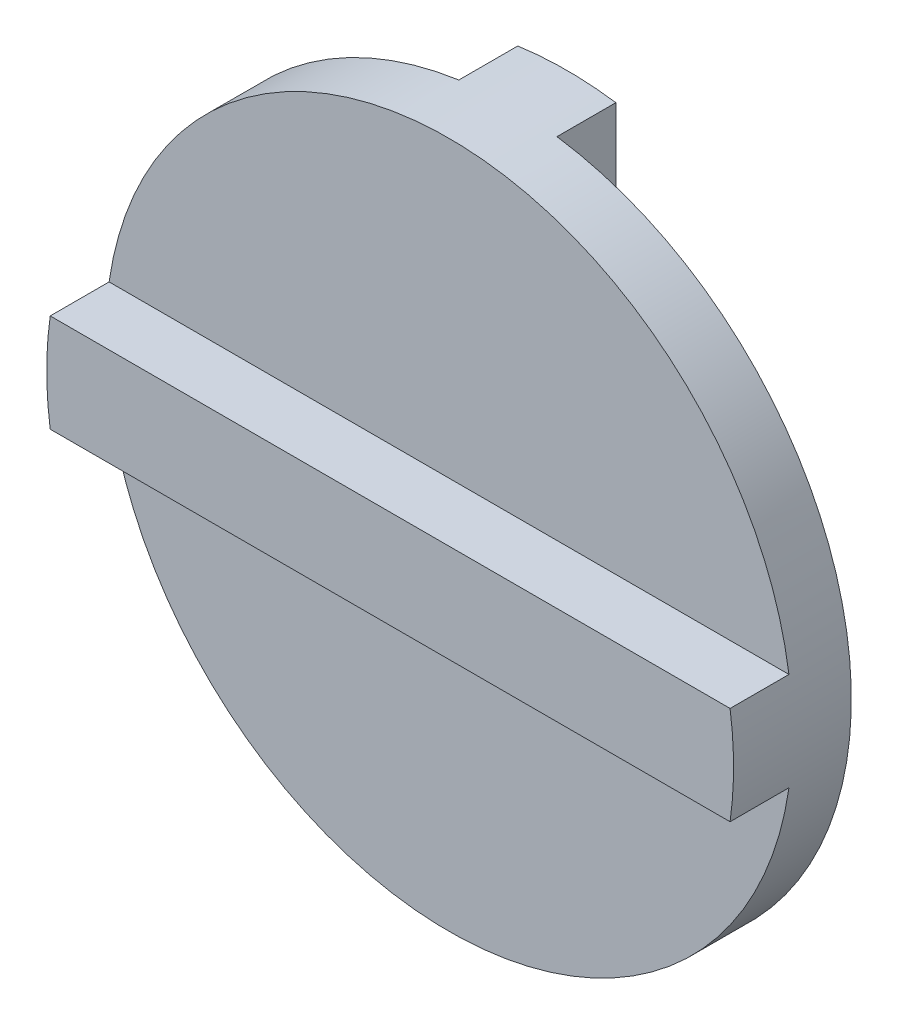
ISO-10303-21;
HEADER;
FILE_DESCRIPTION(('STEP AP214'),'2;1');
FILE_NAME('part.step','',(''),(''),'','','');
FILE_SCHEMA(('AUTOMOTIVE_DESIGN { 1 0 10303 214 1 1 1 1 }'));
ENDSEC;
DATA;
#1=APPLICATION_CONTEXT('core data for automotive mechanical design processes');
#2=APPLICATION_PROTOCOL_DEFINITION('international standard','automotive_design',2000,#1);
#3=PRODUCT_CONTEXT('',#1,'mechanical');
#4=PRODUCT('Part','Part','',(#3));
#5=PRODUCT_RELATED_PRODUCT_CATEGORY('part','',(#4));
#6=PRODUCT_DEFINITION_FORMATION('','',#4);
#7=PRODUCT_DEFINITION_CONTEXT('part definition',#1,'design');
#8=PRODUCT_DEFINITION('design','',#6,#7);
#9=PRODUCT_DEFINITION_SHAPE('','',#8);
#10=(LENGTH_UNIT() NAMED_UNIT(*) SI_UNIT(.MILLI.,.METRE.));
#11=(NAMED_UNIT(*) PLANE_ANGLE_UNIT() SI_UNIT($,.RADIAN.));
#12=(NAMED_UNIT(*) SI_UNIT($,.STERADIAN.) SOLID_ANGLE_UNIT());
#13=UNCERTAINTY_MEASURE_WITH_UNIT(LENGTH_MEASURE(1.E-05),#10,'distance_accuracy_value','');
#14=(GEOMETRIC_REPRESENTATION_CONTEXT(3) GLOBAL_UNCERTAINTY_ASSIGNED_CONTEXT((#13)) GLOBAL_UNIT_ASSIGNED_CONTEXT((#10,
#11,#12)) REPRESENTATION_CONTEXT('',''));
#15=CARTESIAN_POINT('',(0.,0.,0.));
#16=DIRECTION('',(0.,0.,1.));
#17=DIRECTION('',(1.,0.,0.));
#18=AXIS2_PLACEMENT_3D('',#15,#16,#17);
#19=CARTESIAN_POINT('',(0.,0.,-3.));
#20=DIRECTION('',(0.,0.,1.));
#21=DIRECTION('',(1.,0.,0.));
#22=AXIS2_PLACEMENT_3D('',#19,#20,#21);
#23=PLANE('',#22);
#24=DIRECTION('',(0.,-1.,0.));
#25=VECTOR('',#24,1.);
#26=CARTESIAN_POINT('',(5.,-34.6410161513776,-3.));
#27=LINE('',#26,#25);
#28=CARTESIAN_POINT('',(5.,34.6410161513776,-3.));
#29=VERTEX_POINT('',#28);
#30=CARTESIAN_POINT('',(5.,-34.6410161513776,-3.));
#31=VERTEX_POINT('',#30);
#32=EDGE_CURVE('E125',#29,#31,#27,.T.);
#33=ORIENTED_EDGE('',*,*,#32,.F.);
#34=CARTESIAN_POINT('',(0.,0.,-3.));
#35=DIRECTION('',(0.,0.,1.));
#36=DIRECTION('',(1.,0.,0.));
#37=AXIS2_PLACEMENT_3D('',#34,#35,#36);
#38=CIRCLE('',#37,35.);
#39=EDGE_CURVE('E43',#31,#29,#38,.T.);
#40=ORIENTED_EDGE('',*,*,#39,.F.);
#41=EDGE_LOOP('',(#33,#40));
#42=FACE_BOUND('',#41,.T.);
#43=ADVANCED_FACE('F39',(#42),#23,.F.);
#44=DIRECTION('',(0.,1.,0.));
#45=VECTOR('',#44,1.);
#46=CARTESIAN_POINT('',(-5.,-34.6410161513776,-3.));
#47=LINE('',#46,#45);
#48=CARTESIAN_POINT('',(-5.,-34.6410161513776,-3.));
#49=VERTEX_POINT('',#48);
#50=CARTESIAN_POINT('',(-5.,34.6410161513776,-3.));
#51=VERTEX_POINT('',#50);
#52=EDGE_CURVE('E58',#49,#51,#47,.T.);
#53=ORIENTED_EDGE('',*,*,#52,.F.);
#54=EDGE_CURVE('E121',#51,#49,#38,.T.);
#55=ORIENTED_EDGE('',*,*,#54,.F.);
#56=EDGE_LOOP('',(#53,#55));
#57=FACE_BOUND('',#56,.T.);
#58=ADVANCED_FACE('F176',(#57),#23,.F.);
#59=CARTESIAN_POINT('',(0.,0.,3.));
#60=DIRECTION('',(0.,0.,1.));
#61=DIRECTION('',(1.,0.,0.));
#62=AXIS2_PLACEMENT_3D('',#59,#60,#61);
#63=PLANE('',#62);
#64=DIRECTION('',(-1.,0.,0.));
#65=VECTOR('',#64,1.);
#66=CARTESIAN_POINT('',(34.6410161513776,5.,3.));
#67=LINE('',#66,#65);
#68=CARTESIAN_POINT('',(34.6410161513776,5.,3.));
#69=VERTEX_POINT('',#68);
#70=CARTESIAN_POINT('',(-34.6410161513776,4.99999999999999,3.));
#71=VERTEX_POINT('',#70);
#72=EDGE_CURVE('E126',#69,#71,#67,.T.);
#73=ORIENTED_EDGE('',*,*,#72,.F.);
#74=CARTESIAN_POINT('',(0.,0.,3.));
#75=DIRECTION('',(0.,0.,1.));
#76=DIRECTION('',(1.,0.,0.));
#77=AXIS2_PLACEMENT_3D('',#74,#75,#76);
#78=CIRCLE('',#77,35.);
#79=EDGE_CURVE('E11',#69,#71,#78,.T.);
#80=ORIENTED_EDGE('',*,*,#79,.T.);
#81=EDGE_LOOP('',(#73,#80));
#82=FACE_BOUND('',#81,.T.);
#83=ADVANCED_FACE('F180',(#82),#63,.T.);
#84=CARTESIAN_POINT('',(0.,0.,3.));
#85=DIRECTION('',(0.,0.,-1.));
#86=DIRECTION('',(-1.,0.,0.));
#87=AXIS2_PLACEMENT_3D('',#84,#85,#86);
#88=CYLINDRICAL_SURFACE('',#87,35.);
#89=ORIENTED_EDGE('',*,*,#79,.F.);
#90=DIRECTION('',(0.,0.,-1.));
#91=VECTOR('',#90,1.);
#92=CARTESIAN_POINT('',(34.6410161513775,5.00000000000002,9.));
#93=LINE('',#92,#91);
#94=CARTESIAN_POINT('',(34.6410161513775,5.00000000000002,9.));
#95=VERTEX_POINT('',#94);
#96=EDGE_CURVE('E146',#95,#69,#93,.T.);
#97=ORIENTED_EDGE('',*,*,#96,.F.);
#98=CARTESIAN_POINT('',(0.,0.,9.));
#99=DIRECTION('',(0.,0.,1.));
#100=DIRECTION('',(1.,0.,0.));
#101=AXIS2_PLACEMENT_3D('',#98,#99,#100);
#102=CIRCLE('',#101,35.);
#103=CARTESIAN_POINT('',(34.6410161513775,-5.,9.));
#104=VERTEX_POINT('',#103);
#105=EDGE_CURVE('E136',#104,#95,#102,.T.);
#106=ORIENTED_EDGE('',*,*,#105,.F.);
#107=DIRECTION('',(0.,0.,-1.));
#108=VECTOR('',#107,1.);
#109=CARTESIAN_POINT('',(34.6410161513775,-5.,9.));
#110=LINE('',#109,#108);
#111=CARTESIAN_POINT('',(34.6410161513775,-5.,3.));
#112=VERTEX_POINT('',#111);
#113=EDGE_CURVE('E151',#104,#112,#110,.T.);
#114=ORIENTED_EDGE('',*,*,#113,.T.);
#115=CARTESIAN_POINT('',(-34.6410161513776,-5.00000000000001,3.));
#116=VERTEX_POINT('',#115);
#117=EDGE_CURVE('E48',#116,#112,#78,.T.);
#118=ORIENTED_EDGE('',*,*,#117,.F.);
#119=DIRECTION('',(0.,0.,-1.));
#120=VECTOR('',#119,1.);
#121=CARTESIAN_POINT('',(-34.6410161513775,-5.00000000000001,9.));
#122=LINE('',#121,#120);
#123=CARTESIAN_POINT('',(-34.6410161513775,-5.00000000000001,9.));
#124=VERTEX_POINT('',#123);
#125=EDGE_CURVE('E152',#124,#116,#122,.T.);
#126=ORIENTED_EDGE('',*,*,#125,.F.);
#127=CARTESIAN_POINT('',(0.,0.,9.));
#128=DIRECTION('',(0.,0.,1.));
#129=DIRECTION('',(1.,0.,0.));
#130=AXIS2_PLACEMENT_3D('',#127,#128,#129);
#131=CIRCLE('',#130,35.);
#132=CARTESIAN_POINT('',(-34.6410161513776,4.99999999999999,9.));
#133=VERTEX_POINT('',#132);
#134=EDGE_CURVE('E131',#133,#124,#131,.T.);
#135=ORIENTED_EDGE('',*,*,#134,.F.);
#136=DIRECTION('',(0.,0.,-1.));
#137=VECTOR('',#136,1.);
#138=CARTESIAN_POINT('',(-34.6410161513776,4.99999999999999,9.));
#139=LINE('',#138,#137);
#140=EDGE_CURVE('E142',#133,#71,#139,.T.);
#141=ORIENTED_EDGE('',*,*,#140,.T.);
#142=EDGE_LOOP('',(#89,#97,#106,#114,#118,#126,#135,#141));
#143=FACE_BOUND('',#142,.T.);
#144=ORIENTED_EDGE('',*,*,#39,.T.);
#145=DIRECTION('',(0.,0.,1.));
#146=VECTOR('',#145,1.);
#147=CARTESIAN_POINT('',(5.,34.6410161513776,-9.));
#148=LINE('',#147,#146);
#149=CARTESIAN_POINT('',(5.,34.6410161513776,-9.));
#150=VERTEX_POINT('',#149);
#151=EDGE_CURVE('E128',#150,#29,#148,.T.);
#152=ORIENTED_EDGE('',*,*,#151,.F.);
#153=CARTESIAN_POINT('',(0.,0.,-9.));
#154=DIRECTION('',(0.,0.,-1.));
#155=DIRECTION('',(-1.,0.,0.));
#156=AXIS2_PLACEMENT_3D('',#153,#154,#155);
#157=CIRCLE('',#156,35.);
#158=CARTESIAN_POINT('',(-5.,34.6410161513776,-9.));
#159=VERTEX_POINT('',#158);
#160=EDGE_CURVE('E115',#159,#150,#157,.T.);
#161=ORIENTED_EDGE('',*,*,#160,.F.);
#162=DIRECTION('',(0.,0.,1.));
#163=VECTOR('',#162,1.);
#164=CARTESIAN_POINT('',(-5.,34.6410161513776,-9.));
#165=LINE('',#164,#163);
#166=EDGE_CURVE('E108',#159,#51,#165,.T.);
#167=ORIENTED_EDGE('',*,*,#166,.T.);
#168=ORIENTED_EDGE('',*,*,#54,.T.);
#169=DIRECTION('',(0.,0.,1.));
#170=VECTOR('',#169,1.);
#171=CARTESIAN_POINT('',(-5.,-34.6410161513776,-9.));
#172=LINE('',#171,#170);
#173=CARTESIAN_POINT('',(-5.,-34.6410161513776,-9.));
#174=VERTEX_POINT('',#173);
#175=EDGE_CURVE('E110',#174,#49,#172,.T.);
#176=ORIENTED_EDGE('',*,*,#175,.F.);
#177=CARTESIAN_POINT('',(0.,0.,-9.));
#178=DIRECTION('',(0.,0.,-1.));
#179=DIRECTION('',(-1.,0.,0.));
#180=AXIS2_PLACEMENT_3D('',#177,#178,#179);
#181=CIRCLE('',#180,35.);
#182=CARTESIAN_POINT('',(5.,-34.6410161513776,-9.));
#183=VERTEX_POINT('',#182);
#184=EDGE_CURVE('E114',#183,#174,#181,.T.);
#185=ORIENTED_EDGE('',*,*,#184,.F.);
#186=DIRECTION('',(0.,0.,1.));
#187=VECTOR('',#186,1.);
#188=CARTESIAN_POINT('',(5.,-34.6410161513776,-9.));
#189=LINE('',#188,#187);
#190=EDGE_CURVE('E198',#183,#31,#189,.T.);
#191=ORIENTED_EDGE('',*,*,#190,.T.);
#192=EDGE_LOOP('',(#144,#152,#161,#167,#168,#176,#185,#191));
#193=FACE_BOUND('',#192,.T.);
#194=ADVANCED_FACE('F41',(#143,#193),#88,.T.);
#195=DIRECTION('',(1.,0.,0.));
#196=VECTOR('',#195,1.);
#197=CARTESIAN_POINT('',(34.6410161513775,-5.,3.));
#198=LINE('',#197,#196);
#199=EDGE_CURVE('E123',#116,#112,#198,.T.);
#200=ORIENTED_EDGE('',*,*,#199,.F.);
#201=ORIENTED_EDGE('',*,*,#117,.T.);
#202=EDGE_LOOP('',(#200,#201));
#203=FACE_BOUND('',#202,.T.);
#204=ADVANCED_FACE('F165',(#203),#63,.T.);
#205=CARTESIAN_POINT('',(34.6410161513775,-5.,9.));
#206=DIRECTION('',(0.,1.,0.));
#207=DIRECTION('',(-1.,0.,0.));
#208=AXIS2_PLACEMENT_3D('',#205,#206,#207);
#209=PLANE('',#208);
#210=ORIENTED_EDGE('',*,*,#199,.T.);
#211=ORIENTED_EDGE('',*,*,#113,.F.);
#212=DIRECTION('',(1.,0.,0.));
#213=VECTOR('',#212,1.);
#214=CARTESIAN_POINT('',(34.6410161513775,-5.,9.));
#215=LINE('',#214,#213);
#216=EDGE_CURVE('E140',#124,#104,#215,.T.);
#217=ORIENTED_EDGE('',*,*,#216,.F.);
#218=ORIENTED_EDGE('',*,*,#125,.T.);
#219=EDGE_LOOP('',(#210,#211,#217,#218));
#220=FACE_BOUND('',#219,.T.);
#221=ADVANCED_FACE('F164',(#220),#209,.F.);
#222=CARTESIAN_POINT('',(34.6410161513776,5.,9.));
#223=DIRECTION('',(0.,-1.,0.));
#224=DIRECTION('',(1.,0.,0.));
#225=AXIS2_PLACEMENT_3D('',#222,#223,#224);
#226=PLANE('',#225);
#227=ORIENTED_EDGE('',*,*,#72,.T.);
#228=ORIENTED_EDGE('',*,*,#140,.F.);
#229=DIRECTION('',(-1.,0.,0.));
#230=VECTOR('',#229,1.);
#231=CARTESIAN_POINT('',(34.6410161513776,5.,9.));
#232=LINE('',#231,#230);
#233=EDGE_CURVE('E143',#95,#133,#232,.T.);
#234=ORIENTED_EDGE('',*,*,#233,.F.);
#235=ORIENTED_EDGE('',*,*,#96,.T.);
#236=EDGE_LOOP('',(#227,#228,#234,#235));
#237=FACE_BOUND('',#236,.T.);
#238=ADVANCED_FACE('F173',(#237),#226,.F.);
#239=CARTESIAN_POINT('',(0.,0.,9.));
#240=DIRECTION('',(0.,0.,1.));
#241=DIRECTION('',(1.,0.,0.));
#242=AXIS2_PLACEMENT_3D('',#239,#240,#241);
#243=PLANE('',#242);
#244=ORIENTED_EDGE('',*,*,#134,.T.);
#245=ORIENTED_EDGE('',*,*,#216,.T.);
#246=ORIENTED_EDGE('',*,*,#105,.T.);
#247=ORIENTED_EDGE('',*,*,#233,.T.);
#248=EDGE_LOOP('',(#244,#245,#246,#247));
#249=FACE_BOUND('',#248,.T.);
#250=ADVANCED_FACE('F172',(#249),#243,.T.);
#251=CARTESIAN_POINT('',(-5.,-34.6410161513776,-9.));
#252=DIRECTION('',(1.,0.,0.));
#253=DIRECTION('',(0.,0.,-1.));
#254=AXIS2_PLACEMENT_3D('',#251,#252,#253);
#255=PLANE('',#254);
#256=ORIENTED_EDGE('',*,*,#52,.T.);
#257=ORIENTED_EDGE('',*,*,#166,.F.);
#258=DIRECTION('',(0.,1.,0.));
#259=VECTOR('',#258,1.);
#260=CARTESIAN_POINT('',(-5.,-34.6410161513776,-9.));
#261=LINE('',#260,#259);
#262=EDGE_CURVE('E103',#174,#159,#261,.T.);
#263=ORIENTED_EDGE('',*,*,#262,.F.);
#264=ORIENTED_EDGE('',*,*,#175,.T.);
#265=EDGE_LOOP('',(#256,#257,#263,#264));
#266=FACE_BOUND('',#265,.T.);
#267=ADVANCED_FACE('F104',(#266),#255,.F.);
#268=CARTESIAN_POINT('',(5.,-34.6410161513776,-9.));
#269=DIRECTION('',(-1.,0.,0.));
#270=DIRECTION('',(0.,0.,1.));
#271=AXIS2_PLACEMENT_3D('',#268,#269,#270);
#272=PLANE('',#271);
#273=ORIENTED_EDGE('',*,*,#32,.T.);
#274=ORIENTED_EDGE('',*,*,#190,.F.);
#275=DIRECTION('',(0.,-1.,0.));
#276=VECTOR('',#275,1.);
#277=CARTESIAN_POINT('',(5.,-34.6410161513776,-9.));
#278=LINE('',#277,#276);
#279=EDGE_CURVE('E119',#150,#183,#278,.T.);
#280=ORIENTED_EDGE('',*,*,#279,.F.);
#281=ORIENTED_EDGE('',*,*,#151,.T.);
#282=EDGE_LOOP('',(#273,#274,#280,#281));
#283=FACE_BOUND('',#282,.T.);
#284=ADVANCED_FACE('F197',(#283),#272,.F.);
#285=CARTESIAN_POINT('',(0.,0.,-9.));
#286=DIRECTION('',(0.,0.,-1.));
#287=DIRECTION('',(-1.,0.,0.));
#288=AXIS2_PLACEMENT_3D('',#285,#286,#287);
#289=PLANE('',#288);
#290=ORIENTED_EDGE('',*,*,#184,.T.);
#291=ORIENTED_EDGE('',*,*,#262,.T.);
#292=ORIENTED_EDGE('',*,*,#160,.T.);
#293=ORIENTED_EDGE('',*,*,#279,.T.);
#294=EDGE_LOOP('',(#290,#291,#292,#293));
#295=FACE_BOUND('',#294,.T.);
#296=ADVANCED_FACE('F117',(#295),#289,.T.);
#297=CLOSED_SHELL('',(#43,#58,#83,#194,#204,#221,#238,#250,#267,#284,#296));
#298=MANIFOLD_SOLID_BREP('B2',#297);
#299=ADVANCED_BREP_SHAPE_REPRESENTATION('',(#18,#298),#14);
#300=SHAPE_DEFINITION_REPRESENTATION(#9,#299);
ENDSEC;
END-ISO-10303-21;
